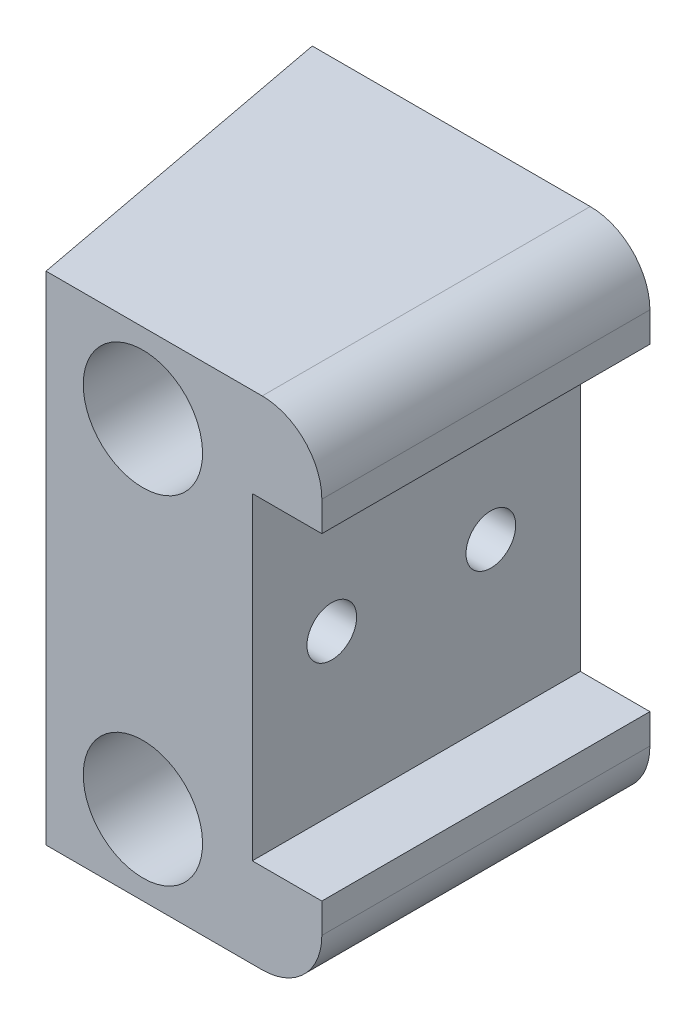
ISO-10303-21;
HEADER;
FILE_DESCRIPTION(('STEP AP214'),'2;1');
FILE_NAME('part.step','',(''),(''),'','','');
FILE_SCHEMA(('AUTOMOTIVE_DESIGN { 1 0 10303 214 1 1 1 1 }'));
ENDSEC;
DATA;
#1=APPLICATION_CONTEXT('core data for automotive mechanical design processes');
#2=APPLICATION_PROTOCOL_DEFINITION('international standard','automotive_design',2000,#1);
#3=PRODUCT_CONTEXT('',#1,'mechanical');
#4=PRODUCT('Part','Part','',(#3));
#5=PRODUCT_RELATED_PRODUCT_CATEGORY('part','',(#4));
#6=PRODUCT_DEFINITION_FORMATION('','',#4);
#7=PRODUCT_DEFINITION_CONTEXT('part definition',#1,'design');
#8=PRODUCT_DEFINITION('design','',#6,#7);
#9=PRODUCT_DEFINITION_SHAPE('','',#8);
#10=(LENGTH_UNIT() NAMED_UNIT(*) SI_UNIT(.MILLI.,.METRE.));
#11=(NAMED_UNIT(*) PLANE_ANGLE_UNIT() SI_UNIT($,.RADIAN.));
#12=(NAMED_UNIT(*) SI_UNIT($,.STERADIAN.) SOLID_ANGLE_UNIT());
#13=UNCERTAINTY_MEASURE_WITH_UNIT(LENGTH_MEASURE(1.E-05),#10,'distance_accuracy_value','');
#14=(GEOMETRIC_REPRESENTATION_CONTEXT(3) GLOBAL_UNCERTAINTY_ASSIGNED_CONTEXT((#13)) GLOBAL_UNIT_ASSIGNED_CONTEXT((#10,
#11,#12)) REPRESENTATION_CONTEXT('',''));
#15=CARTESIAN_POINT('',(0.,0.,0.));
#16=DIRECTION('',(0.,0.,1.));
#17=DIRECTION('',(1.,0.,0.));
#18=AXIS2_PLACEMENT_3D('',#15,#16,#17);
#19=CARTESIAN_POINT('',(18.8315153121948,220.742498750877,252.76163615412));
#20=DIRECTION('',(1.,0.,0.));
#21=DIRECTION('',(0.,0.,-1.));
#22=AXIS2_PLACEMENT_3D('',#19,#20,#21);
#23=CYLINDRICAL_SURFACE('',#22,1.25);
#24=CARTESIAN_POINT('',(23.8315158737115,220.742498750877,252.76163615412));
#25=DIRECTION('',(-1.,0.,0.));
#26=DIRECTION('',(0.,0.,-1.));
#27=AXIS2_PLACEMENT_3D('',#24,#25,#26);
#28=CIRCLE('',#27,1.25);
#29=CARTESIAN_POINT('',(23.8315158737115,220.742498750877,251.51163615412));
#30=VERTEX_POINT('',#29);
#31=EDGE_CURVE('E137',#30,#30,#28,.T.);
#32=ORIENTED_EDGE('',*,*,#31,.F.);
#33=EDGE_LOOP('',(#32));
#34=FACE_BOUND('',#33,.T.);
#35=CARTESIAN_POINT('',(11.1982173386723,220.742498750877,252.76163615412));
#36=DIRECTION('',(0.982661658611137,0.,-0.185407833425695));
#37=DIRECTION('',(-0.185407833425695,0.,-0.982661658611137));
#38=AXIS2_PLACEMENT_3D('',#35,#36,#37);
#39=ELLIPSE('',#38,1.2720553295696,1.25);
#40=CARTESIAN_POINT('',(10.9623683160192,220.742498750877,251.51163615412));
#41=VERTEX_POINT('',#40);
#42=EDGE_CURVE('E149',#41,#41,#39,.T.);
#43=ORIENTED_EDGE('',*,*,#42,.F.);
#44=EDGE_LOOP('',(#43));
#45=FACE_BOUND('',#44,.T.);
#46=ADVANCED_FACE('F15',(#34,#45),#23,.F.);
#47=CARTESIAN_POINT('',(18.8315153121948,220.742498750877,260.76163615412));
#48=DIRECTION('',(1.,0.,0.));
#49=DIRECTION('',(0.,0.,-1.));
#50=AXIS2_PLACEMENT_3D('',#47,#48,#49);
#51=CYLINDRICAL_SURFACE('',#50,1.25);
#52=CARTESIAN_POINT('',(23.8315158737115,220.742498750877,260.76163615412));
#53=DIRECTION('',(-1.,0.,0.));
#54=DIRECTION('',(0.,0.,-1.));
#55=AXIS2_PLACEMENT_3D('',#52,#53,#54);
#56=CIRCLE('',#55,1.25);
#57=CARTESIAN_POINT('',(23.8315158737115,220.742498750877,259.51163615412));
#58=VERTEX_POINT('',#57);
#59=EDGE_CURVE('E219',#58,#58,#56,.T.);
#60=ORIENTED_EDGE('',*,*,#59,.F.);
#61=EDGE_LOOP('',(#60));
#62=FACE_BOUND('',#61,.T.);
#63=CARTESIAN_POINT('',(12.7076510836522,220.742498750877,260.76163615412));
#64=DIRECTION('',(0.982661658611137,0.,-0.185407833425695));
#65=DIRECTION('',(-0.185407833425695,0.,-0.982661658611137));
#66=AXIS2_PLACEMENT_3D('',#63,#64,#65);
#67=ELLIPSE('',#66,1.2720553295696,1.25);
#68=CARTESIAN_POINT('',(12.4718020609991,220.742498750877,259.51163615412));
#69=VERTEX_POINT('',#68);
#70=EDGE_CURVE('E261',#69,#69,#67,.T.);
#71=ORIENTED_EDGE('',*,*,#70,.F.);
#72=EDGE_LOOP('',(#71));
#73=FACE_BOUND('',#72,.T.);
#74=ADVANCED_FACE('F173',(#62,#73),#51,.F.);
#75=CARTESIAN_POINT('',(24.3315158737114,211.242498750877,260.261632339423));
#76=DIRECTION('',(0.,0.,-1.));
#77=DIRECTION('',(0.707106781186551,-0.707106781186544,0.));
#78=AXIS2_PLACEMENT_3D('',#75,#76,#77);
#79=CYLINDRICAL_SURFACE('',#78,3.);
#80=CARTESIAN_POINT('',(24.3315158737114,211.242498750877,248.261632339423));
#81=DIRECTION('',(0.,0.,1.));
#82=DIRECTION('',(0.707106781186551,-0.707106781186544,0.));
#83=AXIS2_PLACEMENT_3D('',#80,#81,#82);
#84=CIRCLE('',#83,3.);
#85=CARTESIAN_POINT('',(24.3315158737114,208.242498750877,248.261632339423));
#86=VERTEX_POINT('',#85);
#87=CARTESIAN_POINT('',(27.3315158737114,211.242498750877,248.261632339423));
#88=VERTEX_POINT('',#87);
#89=EDGE_CURVE('E10',#86,#88,#84,.T.);
#90=ORIENTED_EDGE('',*,*,#89,.T.);
#91=DIRECTION('',(0.,0.,1.));
#92=VECTOR('',#91,1.);
#93=CARTESIAN_POINT('',(27.3315158737114,211.242498750877,260.261632339423));
#94=LINE('',#93,#92);
#95=CARTESIAN_POINT('',(27.3315158737114,211.242498750877,264.76163615412));
#96=VERTEX_POINT('',#95);
#97=EDGE_CURVE('E25',#88,#96,#94,.T.);
#98=ORIENTED_EDGE('',*,*,#97,.T.);
#99=CARTESIAN_POINT('',(24.3315158737114,211.242498750877,264.76163615412));
#100=DIRECTION('',(0.,0.,-1.));
#101=DIRECTION('',(0.707106781186551,-0.707106781186544,0.));
#102=AXIS2_PLACEMENT_3D('',#99,#100,#101);
#103=CIRCLE('',#102,3.);
#104=CARTESIAN_POINT('',(24.3315158737114,208.242498750877,264.76163615412));
#105=VERTEX_POINT('',#104);
#106=EDGE_CURVE('E270',#96,#105,#103,.T.);
#107=ORIENTED_EDGE('',*,*,#106,.T.);
#108=DIRECTION('',(0.,0.,-1.));
#109=VECTOR('',#108,1.);
#110=CARTESIAN_POINT('',(24.3315158737114,208.242498750877,260.261632339423));
#111=LINE('',#110,#109);
#112=EDGE_CURVE('E253',#105,#86,#111,.T.);
#113=ORIENTED_EDGE('',*,*,#112,.T.);
#114=EDGE_LOOP('',(#90,#98,#107,#113));
#115=FACE_BOUND('',#114,.T.);
#116=ADVANCED_FACE('F179',(#115),#79,.T.);
#117=CARTESIAN_POINT('',(27.3315158737114,220.742498750877,260.261632339423));
#118=DIRECTION('',(-1.,0.,0.));
#119=DIRECTION('',(0.,0.,-1.));
#120=AXIS2_PLACEMENT_3D('',#117,#118,#119);
#121=PLANE('',#120);
#122=ORIENTED_EDGE('',*,*,#97,.F.);
#123=DIRECTION('',(0.,-1.,0.));
#124=VECTOR('',#123,1.);
#125=CARTESIAN_POINT('',(27.3315158737114,220.742498750877,248.261632339423));
#126=LINE('',#125,#124);
#127=CARTESIAN_POINT('',(27.3315158737114,212.742498750877,248.261632339423));
#128=VERTEX_POINT('',#127);
#129=EDGE_CURVE('E232',#128,#88,#126,.T.);
#130=ORIENTED_EDGE('',*,*,#129,.F.);
#131=DIRECTION('',(0.,0.,1.));
#132=VECTOR('',#131,1.);
#133=CARTESIAN_POINT('',(27.3315158737114,212.742498750877,261.386639968818));
#134=LINE('',#133,#132);
#135=CARTESIAN_POINT('',(27.3315158737114,212.742498750877,264.76163615412));
#136=VERTEX_POINT('',#135);
#137=EDGE_CURVE('E273',#128,#136,#134,.T.);
#138=ORIENTED_EDGE('',*,*,#137,.T.);
#139=DIRECTION('',(0.,-1.,0.));
#140=VECTOR('',#139,1.);
#141=CARTESIAN_POINT('',(27.3315158737114,219.744330759239,264.76163615412));
#142=LINE('',#141,#140);
#143=EDGE_CURVE('E279',#136,#96,#142,.T.);
#144=ORIENTED_EDGE('',*,*,#143,.T.);
#145=EDGE_LOOP('',(#122,#130,#138,#144));
#146=FACE_BOUND('',#145,.T.);
#147=ADVANCED_FACE('F187',(#146),#121,.F.);
#148=CARTESIAN_POINT('',(21.3315158737114,220.742498750877,248.261632339423));
#149=DIRECTION('',(0.,0.,-1.));
#150=DIRECTION('',(0.,-1.,0.));
#151=AXIS2_PLACEMENT_3D('',#148,#149,#150);
#152=PLANE('',#151);
#153=ORIENTED_EDGE('',*,*,#89,.F.);
#154=DIRECTION('',(-1.,0.,0.));
#155=VECTOR('',#154,1.);
#156=CARTESIAN_POINT('',(21.3315158737114,208.242498750877,248.261632339423));
#157=LINE('',#156,#155);
#158=CARTESIAN_POINT('',(10.3491601373671,208.242498750877,248.261632339423));
#159=VERTEX_POINT('',#158);
#160=EDGE_CURVE('E281',#86,#159,#157,.T.);
#161=ORIENTED_EDGE('',*,*,#160,.T.);
#162=DIRECTION('',(0.,1.,0.));
#163=VECTOR('',#162,1.);
#164=CARTESIAN_POINT('',(10.3491601373671,220.705009936674,248.261632339423));
#165=LINE('',#164,#163);
#166=CARTESIAN_POINT('',(10.3491601373671,233.242498750877,248.261632339423));
#167=VERTEX_POINT('',#166);
#168=EDGE_CURVE('E259',#159,#167,#165,.T.);
#169=ORIENTED_EDGE('',*,*,#168,.T.);
#170=DIRECTION('',(1.,0.,0.));
#171=VECTOR('',#170,1.);
#172=CARTESIAN_POINT('',(21.3315158737114,233.242498750877,248.261632339423));
#173=LINE('',#172,#171);
#174=CARTESIAN_POINT('',(24.3315158737114,233.242498750877,248.261632339423));
#175=VERTEX_POINT('',#174);
#176=EDGE_CURVE('E284',#167,#175,#173,.T.);
#177=ORIENTED_EDGE('',*,*,#176,.T.);
#178=CARTESIAN_POINT('',(24.3315158737114,230.242498750877,248.261632339423));
#179=DIRECTION('',(0.,0.,1.));
#180=DIRECTION('',(0.707106781186551,0.707106781186544,0.));
#181=AXIS2_PLACEMENT_3D('',#178,#179,#180);
#182=CIRCLE('',#181,3.);
#183=CARTESIAN_POINT('',(27.3315158737114,230.242498750877,248.261632339423));
#184=VERTEX_POINT('',#183);
#185=EDGE_CURVE('E239',#184,#175,#182,.T.);
#186=ORIENTED_EDGE('',*,*,#185,.F.);
#187=DIRECTION('',(0.,-1.,0.));
#188=VECTOR('',#187,1.);
#189=CARTESIAN_POINT('',(27.3315158737114,220.742498750877,248.261632339423));
#190=LINE('',#189,#188);
#191=CARTESIAN_POINT('',(27.3315158737114,228.742498750877,248.261632339423));
#192=VERTEX_POINT('',#191);
#193=EDGE_CURVE('E276',#184,#192,#190,.T.);
#194=ORIENTED_EDGE('',*,*,#193,.T.);
#195=DIRECTION('',(1.,0.,0.));
#196=VECTOR('',#195,1.);
#197=CARTESIAN_POINT('',(22.8315158737115,228.742498750877,248.261632339423));
#198=LINE('',#197,#196);
#199=CARTESIAN_POINT('',(23.8315158737115,228.742498750877,248.261632339423));
#200=VERTEX_POINT('',#199);
#201=EDGE_CURVE('E101',#200,#192,#198,.T.);
#202=ORIENTED_EDGE('',*,*,#201,.F.);
#203=DIRECTION('',(0.,1.,0.));
#204=VECTOR('',#203,1.);
#205=CARTESIAN_POINT('',(23.8315158737115,220.742498750877,248.261632339423));
#206=LINE('',#205,#204);
#207=CARTESIAN_POINT('',(23.8315158737115,212.742498750877,248.261632339423));
#208=VERTEX_POINT('',#207);
#209=EDGE_CURVE('E139',#208,#200,#206,.T.);
#210=ORIENTED_EDGE('',*,*,#209,.F.);
#211=DIRECTION('',(-1.,0.,0.));
#212=VECTOR('',#211,1.);
#213=CARTESIAN_POINT('',(22.8315158737115,212.742498750877,248.261632339423));
#214=LINE('',#213,#212);
#215=EDGE_CURVE('E115',#128,#208,#214,.T.);
#216=ORIENTED_EDGE('',*,*,#215,.F.);
#217=ORIENTED_EDGE('',*,*,#129,.T.);
#218=EDGE_LOOP('',(#153,#161,#169,#177,#186,#194,#202,#210,#216,#217));
#219=FACE_BOUND('',#218,.T.);
#220=CARTESIAN_POINT('',(18.3315158737116,212.242498750877,248.261632339423));
#221=DIRECTION('',(0.,0.,1.));
#222=DIRECTION('',(0.,-1.,0.));
#223=AXIS2_PLACEMENT_3D('',#220,#221,#222);
#224=CIRCLE('',#223,1.75);
#225=CARTESIAN_POINT('',(18.3315158737116,210.492498750877,248.261632339423));
#226=VERTEX_POINT('',#225);
#227=EDGE_CURVE('E229',#226,#226,#224,.T.);
#228=ORIENTED_EDGE('',*,*,#227,.T.);
#229=EDGE_LOOP('',(#228));
#230=FACE_BOUND('',#229,.T.);
#231=CARTESIAN_POINT('',(18.3315158737116,229.242498750877,248.261632339423));
#232=DIRECTION('',(0.,0.,1.));
#233=DIRECTION('',(0.,-1.,0.));
#234=AXIS2_PLACEMENT_3D('',#231,#232,#233);
#235=CIRCLE('',#234,1.75);
#236=CARTESIAN_POINT('',(18.3315158737116,227.492498750877,248.261632339423));
#237=VERTEX_POINT('',#236);
#238=EDGE_CURVE('E233',#237,#237,#235,.T.);
#239=ORIENTED_EDGE('',*,*,#238,.T.);
#240=EDGE_LOOP('',(#239));
#241=FACE_BOUND('',#240,.T.);
#242=ADVANCED_FACE('F191',(#219,#230,#241),#152,.T.);
#243=CARTESIAN_POINT('',(24.3315158737114,230.242498750877,260.261632339423));
#244=DIRECTION('',(0.,0.,1.));
#245=DIRECTION('',(0.707106781186551,0.707106781186544,0.));
#246=AXIS2_PLACEMENT_3D('',#243,#244,#245);
#247=CYLINDRICAL_SURFACE('',#246,3.);
#248=CARTESIAN_POINT('',(24.3315158737114,230.242498750877,264.76163615412));
#249=DIRECTION('',(0.,0.,-1.));
#250=DIRECTION('',(0.707106781186551,0.707106781186544,0.));
#251=AXIS2_PLACEMENT_3D('',#248,#249,#250);
#252=CIRCLE('',#251,3.);
#253=CARTESIAN_POINT('',(24.3315158737114,233.242498750877,264.76163615412));
#254=VERTEX_POINT('',#253);
#255=CARTESIAN_POINT('',(27.3315158737114,230.242498750877,264.76163615412));
#256=VERTEX_POINT('',#255);
#257=EDGE_CURVE('E236',#254,#256,#252,.T.);
#258=ORIENTED_EDGE('',*,*,#257,.T.);
#259=DIRECTION('',(0.,0.,-1.));
#260=VECTOR('',#259,1.);
#261=CARTESIAN_POINT('',(27.3315158737114,230.242498750877,260.261632339423));
#262=LINE('',#261,#260);
#263=EDGE_CURVE('E108',#256,#184,#262,.T.);
#264=ORIENTED_EDGE('',*,*,#263,.T.);
#265=ORIENTED_EDGE('',*,*,#185,.T.);
#266=DIRECTION('',(0.,0.,1.));
#267=VECTOR('',#266,1.);
#268=CARTESIAN_POINT('',(24.3315158737114,233.242498750877,260.261632339423));
#269=LINE('',#268,#267);
#270=EDGE_CURVE('E240',#175,#254,#269,.T.);
#271=ORIENTED_EDGE('',*,*,#270,.T.);
#272=EDGE_LOOP('',(#258,#264,#265,#271));
#273=FACE_BOUND('',#272,.T.);
#274=ADVANCED_FACE('F194',(#273),#247,.T.);
#275=CARTESIAN_POINT('',(21.3315158737114,233.242498750877,260.261632339423));
#276=DIRECTION('',(0.,-1.,0.));
#277=DIRECTION('',(0.,0.,1.));
#278=AXIS2_PLACEMENT_3D('',#275,#276,#277);
#279=PLANE('',#278);
#280=ORIENTED_EDGE('',*,*,#270,.F.);
#281=ORIENTED_EDGE('',*,*,#176,.F.);
#282=DIRECTION('',(0.185407833425695,0.,0.982661658611137));
#283=VECTOR('',#282,1.);
#284=CARTESIAN_POINT('',(12.7694037599569,233.242498750877,261.088925385649));
#285=LINE('',#284,#283);
#286=CARTESIAN_POINT('',(13.4623679561422,233.242498750877,264.76163615412));
#287=VERTEX_POINT('',#286);
#288=EDGE_CURVE('E242',#167,#287,#285,.T.);
#289=ORIENTED_EDGE('',*,*,#288,.T.);
#290=DIRECTION('',(1.,0.,0.));
#291=VECTOR('',#290,1.);
#292=CARTESIAN_POINT('',(20.0644403350762,233.242498750877,264.76163615412));
#293=LINE('',#292,#291);
#294=EDGE_CURVE('E245',#287,#254,#293,.T.);
#295=ORIENTED_EDGE('',*,*,#294,.T.);
#296=EDGE_LOOP('',(#280,#281,#289,#295));
#297=FACE_BOUND('',#296,.T.);
#298=ADVANCED_FACE('F198',(#297),#279,.F.);
#299=CARTESIAN_POINT('',(21.3315158737114,208.242498750877,260.261632339423));
#300=DIRECTION('',(0.,1.,0.));
#301=DIRECTION('',(0.,0.,-1.));
#302=AXIS2_PLACEMENT_3D('',#299,#300,#301);
#303=PLANE('',#302);
#304=ORIENTED_EDGE('',*,*,#112,.F.);
#305=DIRECTION('',(-1.,0.,0.));
#306=VECTOR('',#305,1.);
#307=CARTESIAN_POINT('',(20.0644403350762,208.242498750877,264.76163615412));
#308=LINE('',#307,#306);
#309=CARTESIAN_POINT('',(13.4623679561422,208.242498750877,264.76163615412));
#310=VERTEX_POINT('',#309);
#311=EDGE_CURVE('E133',#105,#310,#308,.T.);
#312=ORIENTED_EDGE('',*,*,#311,.T.);
#313=DIRECTION('',(0.185407833425695,0.,0.982661658611137));
#314=VECTOR('',#313,1.);
#315=CARTESIAN_POINT('',(12.7694037599569,208.242498750877,261.088925385649));
#316=LINE('',#315,#314);
#317=EDGE_CURVE('E123',#159,#310,#316,.T.);
#318=ORIENTED_EDGE('',*,*,#317,.F.);
#319=ORIENTED_EDGE('',*,*,#160,.F.);
#320=EDGE_LOOP('',(#304,#312,#318,#319));
#321=FACE_BOUND('',#320,.T.);
#322=ADVANCED_FACE('F202',(#321),#303,.F.);
#323=CARTESIAN_POINT('',(18.7973647964409,218.746162767601,264.76163615412));
#324=DIRECTION('',(0.,0.,1.));
#325=DIRECTION('',(0.,-1.,0.));
#326=AXIS2_PLACEMENT_3D('',#323,#324,#325);
#327=PLANE('',#326);
#328=ORIENTED_EDGE('',*,*,#106,.F.);
#329=ORIENTED_EDGE('',*,*,#143,.F.);
#330=DIRECTION('',(1.,0.,0.));
#331=VECTOR('',#330,1.);
#332=CARTESIAN_POINT('',(21.5644403350762,212.742498750877,264.76163615412));
#333=LINE('',#332,#331);
#334=CARTESIAN_POINT('',(23.8315158737115,212.742498750877,264.76163615412));
#335=VERTEX_POINT('',#334);
#336=EDGE_CURVE('E113',#335,#136,#333,.T.);
#337=ORIENTED_EDGE('',*,*,#336,.F.);
#338=DIRECTION('',(0.,-1.,0.));
#339=VECTOR('',#338,1.);
#340=CARTESIAN_POINT('',(23.8315158737115,219.744330759239,264.76163615412));
#341=LINE('',#340,#339);
#342=CARTESIAN_POINT('',(23.8315158737115,228.742498750877,264.76163615412));
#343=VERTEX_POINT('',#342);
#344=EDGE_CURVE('E98',#343,#335,#341,.T.);
#345=ORIENTED_EDGE('',*,*,#344,.F.);
#346=DIRECTION('',(-1.,0.,0.));
#347=VECTOR('',#346,1.);
#348=CARTESIAN_POINT('',(21.5644403350762,228.742498750877,264.76163615412));
#349=LINE('',#348,#347);
#350=CARTESIAN_POINT('',(27.3315158737114,228.742498750877,264.76163615412));
#351=VERTEX_POINT('',#350);
#352=EDGE_CURVE('E88',#351,#343,#349,.T.);
#353=ORIENTED_EDGE('',*,*,#352,.F.);
#354=DIRECTION('',(0.,-1.,0.));
#355=VECTOR('',#354,1.);
#356=CARTESIAN_POINT('',(27.3315158737114,219.744330759239,264.76163615412));
#357=LINE('',#356,#355);
#358=EDGE_CURVE('E96',#256,#351,#357,.T.);
#359=ORIENTED_EDGE('',*,*,#358,.F.);
#360=ORIENTED_EDGE('',*,*,#257,.F.);
#361=ORIENTED_EDGE('',*,*,#294,.F.);
#362=DIRECTION('',(0.,1.,0.));
#363=VECTOR('',#362,1.);
#364=CARTESIAN_POINT('',(13.4623679561422,219.706841945036,264.76163615412));
#365=LINE('',#364,#363);
#366=EDGE_CURVE('E110',#310,#287,#365,.T.);
#367=ORIENTED_EDGE('',*,*,#366,.F.);
#368=ORIENTED_EDGE('',*,*,#311,.F.);
#369=EDGE_LOOP('',(#328,#329,#337,#345,#353,#359,#360,#361,#367,#368));
#370=FACE_BOUND('',#369,.T.);
#371=CARTESIAN_POINT('',(18.3315158737116,212.242498750877,264.76163615412));
#372=DIRECTION('',(0.,0.,-1.));
#373=DIRECTION('',(0.,-1.,0.));
#374=AXIS2_PLACEMENT_3D('',#371,#372,#373);
#375=CIRCLE('',#374,3.);
#376=CARTESIAN_POINT('',(18.3315158737116,209.242498750877,264.76163615412));
#377=VERTEX_POINT('',#376);
#378=EDGE_CURVE('E130',#377,#377,#375,.T.);
#379=ORIENTED_EDGE('',*,*,#378,.T.);
#380=EDGE_LOOP('',(#379));
#381=FACE_BOUND('',#380,.T.);
#382=CARTESIAN_POINT('',(18.3315158737116,229.242498750877,264.76163615412));
#383=DIRECTION('',(0.,0.,-1.));
#384=DIRECTION('',(0.,-1.,0.));
#385=AXIS2_PLACEMENT_3D('',#382,#383,#384);
#386=CIRCLE('',#385,3.);
#387=CARTESIAN_POINT('',(18.3315158737116,226.242498750877,264.76163615412));
#388=VERTEX_POINT('',#387);
#389=EDGE_CURVE('E134',#388,#388,#386,.T.);
#390=ORIENTED_EDGE('',*,*,#389,.T.);
#391=EDGE_LOOP('',(#390));
#392=FACE_BOUND('',#391,.T.);
#393=ADVANCED_FACE('F93',(#370,#381,#392),#327,.T.);
#394=CARTESIAN_POINT('',(23.8315158737115,220.742498750877,262.511647598212));
#395=DIRECTION('',(1.,0.,0.));
#396=DIRECTION('',(0.,0.,1.));
#397=AXIS2_PLACEMENT_3D('',#394,#395,#396);
#398=PLANE('',#397);
#399=ORIENTED_EDGE('',*,*,#31,.T.);
#400=EDGE_LOOP('',(#399));
#401=FACE_BOUND('',#400,.T.);
#402=ORIENTED_EDGE('',*,*,#59,.T.);
#403=EDGE_LOOP('',(#402));
#404=FACE_BOUND('',#403,.T.);
#405=ORIENTED_EDGE('',*,*,#209,.T.);
#406=DIRECTION('',(0.,0.,1.));
#407=VECTOR('',#406,1.);
#408=CARTESIAN_POINT('',(23.8315158737115,228.742498750877,262.511647598212));
#409=LINE('',#408,#407);
#410=EDGE_CURVE('E125',#200,#343,#409,.T.);
#411=ORIENTED_EDGE('',*,*,#410,.T.);
#412=ORIENTED_EDGE('',*,*,#344,.T.);
#413=DIRECTION('',(0.,0.,1.));
#414=VECTOR('',#413,1.);
#415=CARTESIAN_POINT('',(23.8315158737115,212.742498750877,262.511647598212));
#416=LINE('',#415,#414);
#417=EDGE_CURVE('E100',#208,#335,#416,.T.);
#418=ORIENTED_EDGE('',*,*,#417,.F.);
#419=EDGE_LOOP('',(#405,#411,#412,#418));
#420=FACE_BOUND('',#419,.T.);
#421=ADVANCED_FACE('F168',(#401,#404,#420),#398,.T.);
#422=CARTESIAN_POINT('',(18.3315158737116,212.242498750877,260.261647598212));
#423=DIRECTION('',(0.,0.,-1.));
#424=DIRECTION('',(0.,-1.,0.));
#425=AXIS2_PLACEMENT_3D('',#422,#423,#424);
#426=PLANE('',#425);
#427=CARTESIAN_POINT('',(18.3315158737116,212.242498750877,260.261647598212));
#428=DIRECTION('',(0.,0.,1.));
#429=DIRECTION('',(0.,-1.,0.));
#430=AXIS2_PLACEMENT_3D('',#427,#428,#429);
#431=CIRCLE('',#430,1.75);
#432=CARTESIAN_POINT('',(18.3315158737116,210.492498750877,260.261647598212));
#433=VERTEX_POINT('',#432);
#434=EDGE_CURVE('E141',#433,#433,#431,.T.);
#435=ORIENTED_EDGE('',*,*,#434,.F.);
#436=EDGE_LOOP('',(#435));
#437=FACE_BOUND('',#436,.T.);
#438=CARTESIAN_POINT('',(18.3315158737116,212.242498750877,260.261647598212));
#439=DIRECTION('',(0.,0.,-1.));
#440=DIRECTION('',(0.,-1.,0.));
#441=AXIS2_PLACEMENT_3D('',#438,#439,#440);
#442=CIRCLE('',#441,3.);
#443=CARTESIAN_POINT('',(18.3315158737116,209.242498750877,260.261647598212));
#444=VERTEX_POINT('',#443);
#445=EDGE_CURVE('E126',#444,#444,#442,.T.);
#446=ORIENTED_EDGE('',*,*,#445,.F.);
#447=EDGE_LOOP('',(#446));
#448=FACE_BOUND('',#447,.T.);
#449=ADVANCED_FACE('F158',(#437,#448),#426,.F.);
#450=CARTESIAN_POINT('',(18.3315158737116,229.242498750877,260.261647598212));
#451=DIRECTION('',(0.,0.,-1.));
#452=DIRECTION('',(0.,-1.,0.));
#453=AXIS2_PLACEMENT_3D('',#450,#451,#452);
#454=PLANE('',#453);
#455=CARTESIAN_POINT('',(18.3315158737116,229.242498750877,260.261647598212));
#456=DIRECTION('',(0.,0.,1.));
#457=DIRECTION('',(0.,-1.,0.));
#458=AXIS2_PLACEMENT_3D('',#455,#456,#457);
#459=CIRCLE('',#458,1.75);
#460=CARTESIAN_POINT('',(18.3315158737116,227.492498750877,260.261647598212));
#461=VERTEX_POINT('',#460);
#462=EDGE_CURVE('E145',#461,#461,#459,.T.);
#463=ORIENTED_EDGE('',*,*,#462,.F.);
#464=EDGE_LOOP('',(#463));
#465=FACE_BOUND('',#464,.T.);
#466=CARTESIAN_POINT('',(18.3315158737116,229.242498750877,260.261647598212));
#467=DIRECTION('',(0.,0.,-1.));
#468=DIRECTION('',(0.,-1.,0.));
#469=AXIS2_PLACEMENT_3D('',#466,#467,#468);
#470=CIRCLE('',#469,3.);
#471=CARTESIAN_POINT('',(18.3315158737116,226.242498750877,260.261647598212));
#472=VERTEX_POINT('',#471);
#473=EDGE_CURVE('E144',#472,#472,#470,.T.);
#474=ORIENTED_EDGE('',*,*,#473,.F.);
#475=EDGE_LOOP('',(#474));
#476=FACE_BOUND('',#475,.T.);
#477=ADVANCED_FACE('F155',(#465,#476),#454,.F.);
#478=CARTESIAN_POINT('',(18.3315158737116,212.242498750877,262.761647598212));
#479=DIRECTION('',(0.,0.,-1.));
#480=DIRECTION('',(0.,-1.,0.));
#481=AXIS2_PLACEMENT_3D('',#478,#479,#480);
#482=CYLINDRICAL_SURFACE('',#481,3.);
#483=ORIENTED_EDGE('',*,*,#378,.F.);
#484=EDGE_LOOP('',(#483));
#485=FACE_BOUND('',#484,.T.);
#486=ORIENTED_EDGE('',*,*,#445,.T.);
#487=EDGE_LOOP('',(#486));
#488=FACE_BOUND('',#487,.T.);
#489=ADVANCED_FACE('F157',(#485,#488),#482,.F.);
#490=CARTESIAN_POINT('',(18.3315158737116,229.242498750877,262.761647598212));
#491=DIRECTION('',(0.,0.,-1.));
#492=DIRECTION('',(0.,-1.,0.));
#493=AXIS2_PLACEMENT_3D('',#490,#491,#492);
#494=CYLINDRICAL_SURFACE('',#493,3.);
#495=ORIENTED_EDGE('',*,*,#389,.F.);
#496=EDGE_LOOP('',(#495));
#497=FACE_BOUND('',#496,.T.);
#498=ORIENTED_EDGE('',*,*,#473,.T.);
#499=EDGE_LOOP('',(#498));
#500=FACE_BOUND('',#499,.T.);
#501=ADVANCED_FACE('F153',(#497,#500),#494,.F.);
#502=CARTESIAN_POINT('',(18.3315158737116,212.242498750877,260.261647598212));
#503=DIRECTION('',(0.,0.,-1.));
#504=DIRECTION('',(0.,-1.,0.));
#505=AXIS2_PLACEMENT_3D('',#502,#503,#504);
#506=CYLINDRICAL_SURFACE('',#505,1.75);
#507=ORIENTED_EDGE('',*,*,#434,.T.);
#508=EDGE_LOOP('',(#507));
#509=FACE_BOUND('',#508,.T.);
#510=ORIENTED_EDGE('',*,*,#227,.F.);
#511=EDGE_LOOP('',(#510));
#512=FACE_BOUND('',#511,.T.);
#513=ADVANCED_FACE('F304',(#509,#512),#506,.F.);
#514=CARTESIAN_POINT('',(18.3315158737116,229.242498750877,260.261647598212));
#515=DIRECTION('',(0.,0.,-1.));
#516=DIRECTION('',(0.,-1.,0.));
#517=AXIS2_PLACEMENT_3D('',#514,#515,#516);
#518=CYLINDRICAL_SURFACE('',#517,1.75);
#519=ORIENTED_EDGE('',*,*,#462,.T.);
#520=EDGE_LOOP('',(#519));
#521=FACE_BOUND('',#520,.T.);
#522=ORIENTED_EDGE('',*,*,#238,.F.);
#523=EDGE_LOOP('',(#522));
#524=FACE_BOUND('',#523,.T.);
#525=ADVANCED_FACE('F300',(#521,#524),#518,.F.);
#526=CARTESIAN_POINT('',(12.625799181881,220.667521122472,260.327821012285));
#527=DIRECTION('',(0.982661658611137,0.,-0.185407833425695));
#528=DIRECTION('',(0.185405354701808,0.00517086956410751,0.982648521372646));
#529=AXIS2_PLACEMENT_3D('',#526,#527,#528);
#530=PLANE('',#529);
#531=ORIENTED_EDGE('',*,*,#42,.T.);
#532=EDGE_LOOP('',(#531));
#533=FACE_BOUND('',#532,.T.);
#534=ORIENTED_EDGE('',*,*,#70,.T.);
#535=EDGE_LOOP('',(#534));
#536=FACE_BOUND('',#535,.T.);
#537=ORIENTED_EDGE('',*,*,#168,.F.);
#538=ORIENTED_EDGE('',*,*,#317,.T.);
#539=ORIENTED_EDGE('',*,*,#366,.T.);
#540=ORIENTED_EDGE('',*,*,#288,.F.);
#541=EDGE_LOOP('',(#537,#538,#539,#540));
#542=FACE_BOUND('',#541,.T.);
#543=ADVANCED_FACE('F257',(#533,#536,#542),#530,.F.);
#544=CARTESIAN_POINT('',(27.3315158737114,220.742498750877,260.261632339423));
#545=DIRECTION('',(-1.,0.,0.));
#546=DIRECTION('',(0.,0.,-1.));
#547=AXIS2_PLACEMENT_3D('',#544,#545,#546);
#548=PLANE('',#547);
#549=ORIENTED_EDGE('',*,*,#263,.F.);
#550=ORIENTED_EDGE('',*,*,#358,.T.);
#551=DIRECTION('',(0.,0.,-1.));
#552=VECTOR('',#551,1.);
#553=CARTESIAN_POINT('',(27.3315158737114,228.742498750877,261.386639968818));
#554=LINE('',#553,#552);
#555=EDGE_CURVE('E19',#351,#192,#554,.T.);
#556=ORIENTED_EDGE('',*,*,#555,.T.);
#557=ORIENTED_EDGE('',*,*,#193,.F.);
#558=EDGE_LOOP('',(#549,#550,#556,#557));
#559=FACE_BOUND('',#558,.T.);
#560=ADVANCED_FACE('F105',(#559),#548,.F.);
#561=CARTESIAN_POINT('',(24.3315158737115,212.742498750877,262.511647598212));
#562=DIRECTION('',(0.,1.,0.));
#563=DIRECTION('',(0.,0.,-1.));
#564=AXIS2_PLACEMENT_3D('',#561,#562,#563);
#565=PLANE('',#564);
#566=ORIENTED_EDGE('',*,*,#336,.T.);
#567=ORIENTED_EDGE('',*,*,#137,.F.);
#568=ORIENTED_EDGE('',*,*,#215,.T.);
#569=ORIENTED_EDGE('',*,*,#417,.T.);
#570=EDGE_LOOP('',(#566,#567,#568,#569));
#571=FACE_BOUND('',#570,.T.);
#572=ADVANCED_FACE('F290',(#571),#565,.T.);
#573=CARTESIAN_POINT('',(24.3315158737115,228.742498750877,262.511647598212));
#574=DIRECTION('',(0.,-1.,0.));
#575=DIRECTION('',(0.,0.,1.));
#576=AXIS2_PLACEMENT_3D('',#573,#574,#575);
#577=PLANE('',#576);
#578=ORIENTED_EDGE('',*,*,#352,.T.);
#579=ORIENTED_EDGE('',*,*,#410,.F.);
#580=ORIENTED_EDGE('',*,*,#201,.T.);
#581=ORIENTED_EDGE('',*,*,#555,.F.);
#582=EDGE_LOOP('',(#578,#579,#580,#581));
#583=FACE_BOUND('',#582,.T.);
#584=ADVANCED_FACE('F17',(#583),#577,.T.);
#585=CLOSED_SHELL('',(#46,#74,#116,#147,#242,#274,#298,#322,#393,#421,#449,#477,#489,#501,#513,
#525,#543,#560,#572,#584));
#586=MANIFOLD_SOLID_BREP('B1',#585);
#587=ADVANCED_BREP_SHAPE_REPRESENTATION('',(#18,#586),#14);
#588=SHAPE_DEFINITION_REPRESENTATION(#9,#587);
ENDSEC;
END-ISO-10303-21;
